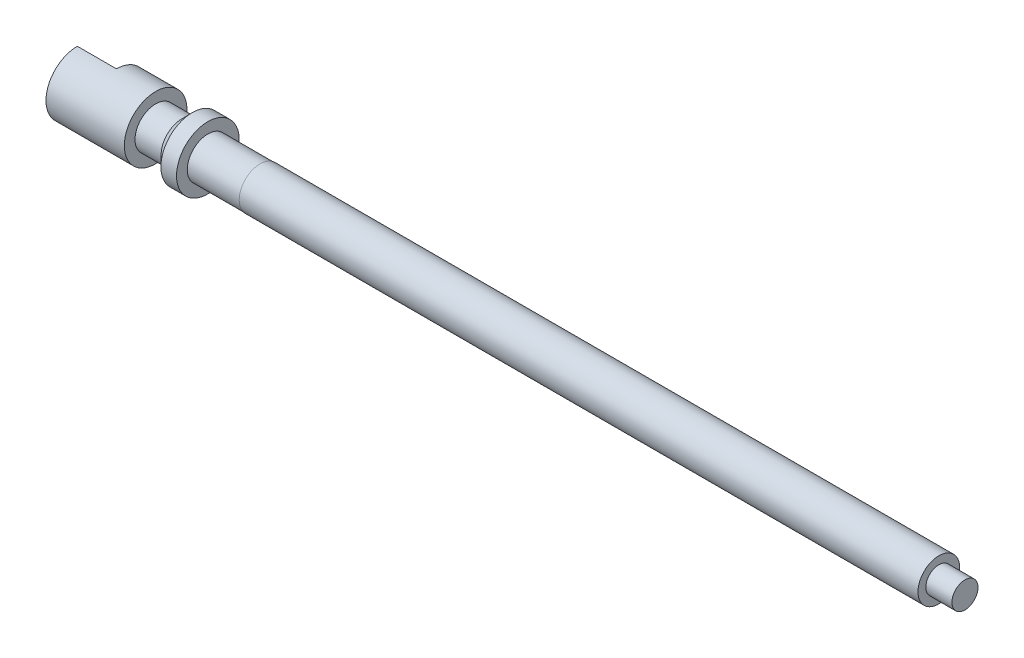
ISO-10303-21;
HEADER;
FILE_DESCRIPTION(('STEP AP214'),'2;1');
FILE_NAME('part.step','',(''),(''),'','','');
FILE_SCHEMA(('AUTOMOTIVE_DESIGN { 1 0 10303 214 1 1 1 1 }'));
ENDSEC;
DATA;
#1=APPLICATION_CONTEXT('core data for automotive mechanical design processes');
#2=APPLICATION_PROTOCOL_DEFINITION('international standard','automotive_design',2000,#1);
#3=PRODUCT_CONTEXT('',#1,'mechanical');
#4=PRODUCT('Part','Part','',(#3));
#5=PRODUCT_RELATED_PRODUCT_CATEGORY('part','',(#4));
#6=PRODUCT_DEFINITION_FORMATION('','',#4);
#7=PRODUCT_DEFINITION_CONTEXT('part definition',#1,'design');
#8=PRODUCT_DEFINITION('design','',#6,#7);
#9=PRODUCT_DEFINITION_SHAPE('','',#8);
#10=(LENGTH_UNIT() NAMED_UNIT(*) SI_UNIT(.MILLI.,.METRE.));
#11=(NAMED_UNIT(*) PLANE_ANGLE_UNIT() SI_UNIT($,.RADIAN.));
#12=(NAMED_UNIT(*) SI_UNIT($,.STERADIAN.) SOLID_ANGLE_UNIT());
#13=UNCERTAINTY_MEASURE_WITH_UNIT(LENGTH_MEASURE(1.E-05),#10,'distance_accuracy_value','');
#14=(GEOMETRIC_REPRESENTATION_CONTEXT(3) GLOBAL_UNCERTAINTY_ASSIGNED_CONTEXT((#13)) GLOBAL_UNIT_ASSIGNED_CONTEXT((#10,
#11,#12)) REPRESENTATION_CONTEXT('',''));
#15=CARTESIAN_POINT('',(0.,0.,0.));
#16=DIRECTION('',(0.,0.,1.));
#17=DIRECTION('',(1.,0.,0.));
#18=AXIS2_PLACEMENT_3D('',#15,#16,#17);
#19=CARTESIAN_POINT('',(-1.3000000416,0.,0.));
#20=DIRECTION('',(1.,0.,0.));
#21=DIRECTION('',(0.,0.,-1.));
#22=AXIS2_PLACEMENT_3D('',#19,#20,#21);
#23=CONICAL_SURFACE('',#22,0.599999943,0.797743128536396);
#24=CARTESIAN_POINT('',(-1.500000048,0.,0.));
#25=DIRECTION('',(-1.,0.,0.));
#26=DIRECTION('',(0.,0.,1.));
#27=AXIS2_PLACEMENT_3D('',#24,#25,#26);
#28=CIRCLE('',#27,0.394999972);
#29=CARTESIAN_POINT('',(-1.500000048,0.,0.394999972));
#30=VERTEX_POINT('',#29);
#31=EDGE_CURVE('E158',#30,#30,#28,.T.);
#32=ORIENTED_EDGE('',*,*,#31,.F.);
#33=EDGE_LOOP('',(#32));
#34=FACE_BOUND('',#33,.T.);
#35=CARTESIAN_POINT('',(-1.3000000416,0.,0.));
#36=DIRECTION('',(-1.,0.,0.));
#37=DIRECTION('',(0.,0.,1.));
#38=AXIS2_PLACEMENT_3D('',#35,#36,#37);
#39=CIRCLE('',#38,0.599999943);
#40=CARTESIAN_POINT('',(-1.3000000416,0.,0.599999943));
#41=VERTEX_POINT('',#40);
#42=EDGE_CURVE('E11',#41,#41,#39,.T.);
#43=ORIENTED_EDGE('',*,*,#42,.T.);
#44=EDGE_LOOP('',(#43));
#45=FACE_BOUND('',#44,.T.);
#46=ADVANCED_FACE('F36',(#34,#45),#23,.T.);
#47=CARTESIAN_POINT('',(-3.99695091603263,0.,0.));
#48=DIRECTION('',(-1.,0.,0.));
#49=DIRECTION('',(0.,0.,1.));
#50=AXIS2_PLACEMENT_3D('',#47,#48,#49);
#51=CYLINDRICAL_SURFACE('',#50,0.599999943000001);
#52=ORIENTED_EDGE('',*,*,#42,.F.);
#53=EDGE_LOOP('',(#52));
#54=FACE_BOUND('',#53,.T.);
#55=CARTESIAN_POINT('',(-1.000000032,0.,0.));
#56=DIRECTION('',(-1.,0.,0.));
#57=DIRECTION('',(0.,0.,1.));
#58=AXIS2_PLACEMENT_3D('',#55,#56,#57);
#59=CIRCLE('',#58,0.599999943000001);
#60=CARTESIAN_POINT('',(-1.000000032,0.,0.599999943000001));
#61=VERTEX_POINT('',#60);
#62=EDGE_CURVE('E43',#61,#61,#59,.T.);
#63=ORIENTED_EDGE('',*,*,#62,.T.);
#64=EDGE_LOOP('',(#63));
#65=FACE_BOUND('',#64,.T.);
#66=ADVANCED_FACE('F104',(#54,#65),#51,.T.);
#67=CARTESIAN_POINT('',(-1.000000032,0.599999943000001,0.));
#68=DIRECTION('',(-1.,0.,0.));
#69=DIRECTION('',(0.,0.,1.));
#70=AXIS2_PLACEMENT_3D('',#67,#68,#69);
#71=PLANE('',#70);
#72=ORIENTED_EDGE('',*,*,#62,.F.);
#73=EDGE_LOOP('',(#72));
#74=FACE_BOUND('',#73,.T.);
#75=CARTESIAN_POINT('',(-1.000000032,0.,0.));
#76=DIRECTION('',(-1.,0.,0.));
#77=DIRECTION('',(0.,0.,1.));
#78=AXIS2_PLACEMENT_3D('',#75,#76,#77);
#79=CIRCLE('',#78,0.394999972);
#80=CARTESIAN_POINT('',(-1.000000032,0.,0.394999972));
#81=VERTEX_POINT('',#80);
#82=EDGE_CURVE('E99',#81,#81,#79,.T.);
#83=ORIENTED_EDGE('',*,*,#82,.T.);
#84=EDGE_LOOP('',(#83));
#85=FACE_BOUND('',#84,.T.);
#86=ADVANCED_FACE('F106',(#74,#85),#71,.F.);
#87=CARTESIAN_POINT('',(-3.99695091603263,0.,0.));
#88=DIRECTION('',(-1.,0.,0.));
#89=DIRECTION('',(0.,0.,1.));
#90=AXIS2_PLACEMENT_3D('',#87,#88,#89);
#91=CYLINDRICAL_SURFACE('',#90,0.394999972);
#92=ORIENTED_EDGE('',*,*,#82,.F.);
#93=EDGE_LOOP('',(#92));
#94=FACE_BOUND('',#93,.T.);
#95=CARTESIAN_POINT('',(0.,0.,0.));
#96=DIRECTION('',(-1.,0.,0.));
#97=DIRECTION('',(0.,0.,1.));
#98=AXIS2_PLACEMENT_3D('',#95,#96,#97);
#99=CIRCLE('',#98,0.394999972);
#100=CARTESIAN_POINT('',(0.,0.,0.394999972));
#101=VERTEX_POINT('',#100);
#102=EDGE_CURVE('E96',#101,#101,#99,.T.);
#103=ORIENTED_EDGE('',*,*,#102,.T.);
#104=EDGE_LOOP('',(#103));
#105=FACE_BOUND('',#104,.T.);
#106=ADVANCED_FACE('F109',(#94,#105),#91,.T.);
#107=CARTESIAN_POINT('',(0.,0.394999972,0.));
#108=DIRECTION('',(1.,0.,0.));
#109=DIRECTION('',(0.,0.,-1.));
#110=AXIS2_PLACEMENT_3D('',#107,#108,#109);
#111=PLANE('',#110);
#112=ORIENTED_EDGE('',*,*,#102,.F.);
#113=EDGE_LOOP('',(#112));
#114=FACE_BOUND('',#113,.T.);
#115=CARTESIAN_POINT('',(0.,0.,0.));
#116=DIRECTION('',(-1.,0.,0.));
#117=DIRECTION('',(0.,0.,1.));
#118=AXIS2_PLACEMENT_3D('',#115,#116,#117);
#119=CIRCLE('',#118,0.399999962);
#120=CARTESIAN_POINT('',(0.,0.,0.399999962));
#121=VERTEX_POINT('',#120);
#122=EDGE_CURVE('E93',#121,#121,#119,.T.);
#123=ORIENTED_EDGE('',*,*,#122,.T.);
#124=EDGE_LOOP('',(#123));
#125=FACE_BOUND('',#124,.T.);
#126=ADVANCED_FACE('F115',(#114,#125),#111,.F.);
#127=CARTESIAN_POINT('',(-3.99695091603263,0.,0.));
#128=DIRECTION('',(-1.,0.,0.));
#129=DIRECTION('',(0.,0.,1.));
#130=AXIS2_PLACEMENT_3D('',#127,#128,#129);
#131=CYLINDRICAL_SURFACE('',#130,0.399999962);
#132=ORIENTED_EDGE('',*,*,#122,.F.);
#133=EDGE_LOOP('',(#132));
#134=FACE_BOUND('',#133,.T.);
#135=CARTESIAN_POINT('',(12.999999908,0.,0.));
#136=DIRECTION('',(-1.,0.,0.));
#137=DIRECTION('',(0.,0.,1.));
#138=AXIS2_PLACEMENT_3D('',#135,#136,#137);
#139=CIRCLE('',#138,0.399999962);
#140=CARTESIAN_POINT('',(12.999999908,0.,0.399999962));
#141=VERTEX_POINT('',#140);
#142=EDGE_CURVE('E90',#141,#141,#139,.T.);
#143=ORIENTED_EDGE('',*,*,#142,.T.);
#144=EDGE_LOOP('',(#143));
#145=FACE_BOUND('',#144,.T.);
#146=ADVANCED_FACE('F121',(#134,#145),#131,.T.);
#147=CARTESIAN_POINT('',(12.999999908,0.399999962,0.));
#148=DIRECTION('',(-1.,0.,0.));
#149=DIRECTION('',(0.,0.,1.));
#150=AXIS2_PLACEMENT_3D('',#147,#148,#149);
#151=PLANE('',#150);
#152=ORIENTED_EDGE('',*,*,#142,.F.);
#153=EDGE_LOOP('',(#152));
#154=FACE_BOUND('',#153,.T.);
#155=CARTESIAN_POINT('',(12.999999908,0.,0.));
#156=DIRECTION('',(-1.,0.,0.));
#157=DIRECTION('',(0.,0.,1.));
#158=AXIS2_PLACEMENT_3D('',#155,#156,#157);
#159=CIRCLE('',#158,0.250000008000001);
#160=CARTESIAN_POINT('',(12.999999908,0.,0.250000008000001));
#161=VERTEX_POINT('',#160);
#162=EDGE_CURVE('E81',#161,#161,#159,.T.);
#163=ORIENTED_EDGE('',*,*,#162,.T.);
#164=EDGE_LOOP('',(#163));
#165=FACE_BOUND('',#164,.T.);
#166=ADVANCED_FACE('F127',(#154,#165),#151,.F.);
#167=CARTESIAN_POINT('',(-3.99695091603263,0.,0.));
#168=DIRECTION('',(-1.,0.,0.));
#169=DIRECTION('',(0.,0.,1.));
#170=AXIS2_PLACEMENT_3D('',#167,#168,#169);
#171=CYLINDRICAL_SURFACE('',#170,0.250000008000001);
#172=ORIENTED_EDGE('',*,*,#162,.F.);
#173=EDGE_LOOP('',(#172));
#174=FACE_BOUND('',#173,.T.);
#175=CARTESIAN_POINT('',(13.499999924,0.,0.));
#176=DIRECTION('',(-1.,0.,0.));
#177=DIRECTION('',(0.,0.,1.));
#178=AXIS2_PLACEMENT_3D('',#175,#176,#177);
#179=CIRCLE('',#178,0.250000008000001);
#180=CARTESIAN_POINT('',(13.499999924,0.,0.250000008000001));
#181=VERTEX_POINT('',#180);
#182=EDGE_CURVE('E77',#181,#181,#179,.T.);
#183=ORIENTED_EDGE('',*,*,#182,.T.);
#184=EDGE_LOOP('',(#183));
#185=FACE_BOUND('',#184,.T.);
#186=ADVANCED_FACE('F133',(#174,#185),#171,.T.);
#187=CARTESIAN_POINT('',(13.499999924,0.250000008000001,0.));
#188=DIRECTION('',(-1.,0.,0.));
#189=DIRECTION('',(0.,0.,1.));
#190=AXIS2_PLACEMENT_3D('',#187,#188,#189);
#191=PLANE('',#190);
#192=ORIENTED_EDGE('',*,*,#182,.F.);
#193=EDGE_LOOP('',(#192));
#194=FACE_BOUND('',#193,.T.);
#195=ADVANCED_FACE('F139',(#194),#191,.F.);
#196=CARTESIAN_POINT('',(-3.500000112,0.599999943,0.));
#197=DIRECTION('',(1.,0.,0.));
#198=DIRECTION('',(0.,0.,-1.));
#199=AXIS2_PLACEMENT_3D('',#196,#197,#198);
#200=PLANE('',#199);
#201=CARTESIAN_POINT('',(-3.500000112,0.,0.));
#202=DIRECTION('',(-1.,0.,0.));
#203=DIRECTION('',(0.,0.,1.));
#204=AXIS2_PLACEMENT_3D('',#201,#202,#203);
#205=CIRCLE('',#204,0.599999943);
#206=CARTESIAN_POINT('',(-3.500000112,-0.599999943,0.));
#207=VERTEX_POINT('',#206);
#208=CARTESIAN_POINT('',(-3.500000112,0.599999943,0.));
#209=VERTEX_POINT('',#208);
#210=EDGE_CURVE('E73',#207,#209,#205,.T.);
#211=ORIENTED_EDGE('',*,*,#210,.T.);
#212=DIRECTION('',(0.,1.,0.));
#213=VECTOR('',#212,1.);
#214=CARTESIAN_POINT('',(-3.500000112,0.599999943,0.));
#215=LINE('',#214,#213);
#216=EDGE_CURVE('E64',#207,#209,#215,.T.);
#217=ORIENTED_EDGE('',*,*,#216,.F.);
#218=EDGE_LOOP('',(#211,#217));
#219=FACE_BOUND('',#218,.T.);
#220=ADVANCED_FACE('F72',(#219),#200,.F.);
#221=CARTESIAN_POINT('',(-3.99695091603263,0.,0.));
#222=DIRECTION('',(-1.,0.,0.));
#223=DIRECTION('',(0.,0.,1.));
#224=AXIS2_PLACEMENT_3D('',#221,#222,#223);
#225=CYLINDRICAL_SURFACE('',#224,0.599999943);
#226=CARTESIAN_POINT('',(-2.750000088,0.,0.));
#227=DIRECTION('',(-1.,0.,0.));
#228=DIRECTION('',(0.,0.,1.));
#229=AXIS2_PLACEMENT_3D('',#226,#227,#228);
#230=CIRCLE('',#229,0.599999943);
#231=CARTESIAN_POINT('',(-2.750000088,0.599999943,0.));
#232=VERTEX_POINT('',#231);
#233=CARTESIAN_POINT('',(-2.750000088,-0.599999943,0.));
#234=VERTEX_POINT('',#233);
#235=EDGE_CURVE('E54',#232,#234,#230,.T.);
#236=ORIENTED_EDGE('',*,*,#235,.F.);
#237=DIRECTION('',(-1.,0.,0.));
#238=VECTOR('',#237,1.);
#239=CARTESIAN_POINT('',(-2.750000088,0.599999943,0.));
#240=LINE('',#239,#238);
#241=EDGE_CURVE('E68',#232,#209,#240,.T.);
#242=ORIENTED_EDGE('',*,*,#241,.T.);
#243=ORIENTED_EDGE('',*,*,#210,.F.);
#244=DIRECTION('',(-1.,0.,0.));
#245=VECTOR('',#244,1.);
#246=CARTESIAN_POINT('',(-2.750000088,-0.599999943,0.));
#247=LINE('',#246,#245);
#248=EDGE_CURVE('E61',#234,#207,#247,.T.);
#249=ORIENTED_EDGE('',*,*,#248,.F.);
#250=EDGE_LOOP('',(#236,#242,#243,#249));
#251=FACE_BOUND('',#250,.T.);
#252=CARTESIAN_POINT('',(-2.000000064,0.,0.));
#253=DIRECTION('',(-1.,0.,0.));
#254=DIRECTION('',(0.,0.,1.));
#255=AXIS2_PLACEMENT_3D('',#252,#253,#254);
#256=CIRCLE('',#255,0.599999943);
#257=CARTESIAN_POINT('',(-2.000000064,0.,0.599999943));
#258=VERTEX_POINT('',#257);
#259=EDGE_CURVE('E78',#258,#258,#256,.T.);
#260=ORIENTED_EDGE('',*,*,#259,.T.);
#261=EDGE_LOOP('',(#260));
#262=FACE_BOUND('',#261,.T.);
#263=ADVANCED_FACE('F75',(#251,#262),#225,.T.);
#264=CARTESIAN_POINT('',(-2.000000064,0.599999943,0.));
#265=DIRECTION('',(-1.,0.,0.));
#266=DIRECTION('',(0.,0.,1.));
#267=AXIS2_PLACEMENT_3D('',#264,#265,#266);
#268=PLANE('',#267);
#269=ORIENTED_EDGE('',*,*,#259,.F.);
#270=EDGE_LOOP('',(#269));
#271=FACE_BOUND('',#270,.T.);
#272=CARTESIAN_POINT('',(-2.000000064,0.,0.));
#273=DIRECTION('',(-1.,0.,0.));
#274=DIRECTION('',(0.,0.,1.));
#275=AXIS2_PLACEMENT_3D('',#272,#273,#274);
#276=CIRCLE('',#275,0.394999972);
#277=CARTESIAN_POINT('',(-2.000000064,0.,0.394999972));
#278=VERTEX_POINT('',#277);
#279=EDGE_CURVE('E84',#278,#278,#276,.T.);
#280=ORIENTED_EDGE('',*,*,#279,.T.);
#281=EDGE_LOOP('',(#280));
#282=FACE_BOUND('',#281,.T.);
#283=ADVANCED_FACE('F168',(#271,#282),#268,.F.);
#284=CARTESIAN_POINT('',(-3.99695091603263,0.,0.));
#285=DIRECTION('',(-1.,0.,0.));
#286=DIRECTION('',(0.,0.,1.));
#287=AXIS2_PLACEMENT_3D('',#284,#285,#286);
#288=CYLINDRICAL_SURFACE('',#287,0.394999972);
#289=ORIENTED_EDGE('',*,*,#279,.F.);
#290=EDGE_LOOP('',(#289));
#291=FACE_BOUND('',#290,.T.);
#292=ORIENTED_EDGE('',*,*,#31,.T.);
#293=EDGE_LOOP('',(#292));
#294=FACE_BOUND('',#293,.T.);
#295=ADVANCED_FACE('F170',(#291,#294),#288,.T.);
#296=CARTESIAN_POINT('',(-2.750000088,0.599999943,0.));
#297=DIRECTION('',(0.,0.,1.));
#298=DIRECTION('',(1.,0.,0.));
#299=AXIS2_PLACEMENT_3D('',#296,#297,#298);
#300=PLANE('',#299);
#301=ORIENTED_EDGE('',*,*,#216,.T.);
#302=ORIENTED_EDGE('',*,*,#241,.F.);
#303=DIRECTION('',(0.,1.,0.));
#304=VECTOR('',#303,1.);
#305=CARTESIAN_POINT('',(-2.750000088,0.599999943,0.));
#306=LINE('',#305,#304);
#307=EDGE_CURVE('E49',#234,#232,#306,.T.);
#308=ORIENTED_EDGE('',*,*,#307,.F.);
#309=ORIENTED_EDGE('',*,*,#248,.T.);
#310=EDGE_LOOP('',(#301,#302,#308,#309));
#311=FACE_BOUND('',#310,.T.);
#312=ADVANCED_FACE('F63',(#311),#300,.F.);
#313=CARTESIAN_POINT('',(-2.750000088,0.,0.));
#314=DIRECTION('',(-1.,0.,0.));
#315=DIRECTION('',(0.,0.,1.));
#316=AXIS2_PLACEMENT_3D('',#313,#314,#315);
#317=PLANE('',#316);
#318=ORIENTED_EDGE('',*,*,#235,.T.);
#319=ORIENTED_EDGE('',*,*,#307,.T.);
#320=EDGE_LOOP('',(#318,#319));
#321=FACE_BOUND('',#320,.T.);
#322=ADVANCED_FACE('F177',(#321),#317,.T.);
#323=CLOSED_SHELL('',(#46,#66,#86,#106,#126,#146,#166,#186,#195,#220,#263,#283,#295,#312,#322));
#324=MANIFOLD_SOLID_BREP('B2',#323);
#325=ADVANCED_BREP_SHAPE_REPRESENTATION('',(#18,#324),#14);
#326=SHAPE_DEFINITION_REPRESENTATION(#9,#325);
ENDSEC;
END-ISO-10303-21;
